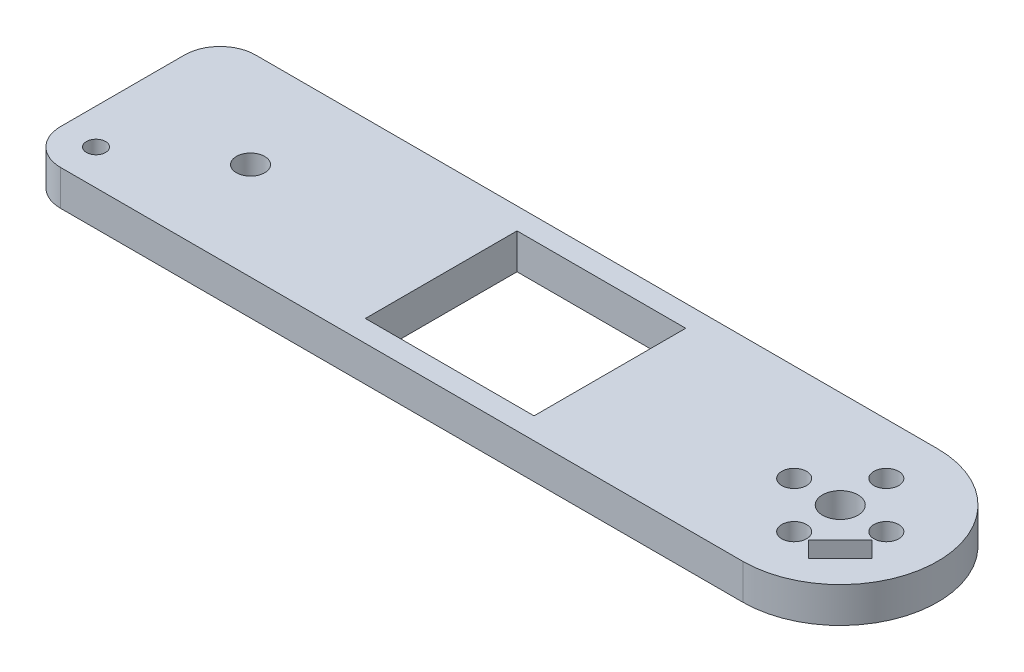
ISO-10303-21;
HEADER;
FILE_DESCRIPTION(('STEP AP214'),'2;1');
FILE_NAME('part.step','',(''),(''),'','','');
FILE_SCHEMA(('AUTOMOTIVE_DESIGN { 1 0 10303 214 1 1 1 1 }'));
ENDSEC;
DATA;
#1=APPLICATION_CONTEXT('core data for automotive mechanical design processes');
#2=APPLICATION_PROTOCOL_DEFINITION('international standard','automotive_design',2000,#1);
#3=PRODUCT_CONTEXT('',#1,'mechanical');
#4=PRODUCT('Part','Part','',(#3));
#5=PRODUCT_RELATED_PRODUCT_CATEGORY('part','',(#4));
#6=PRODUCT_DEFINITION_FORMATION('','',#4);
#7=PRODUCT_DEFINITION_CONTEXT('part definition',#1,'design');
#8=PRODUCT_DEFINITION('design','',#6,#7);
#9=PRODUCT_DEFINITION_SHAPE('','',#8);
#10=(LENGTH_UNIT() NAMED_UNIT(*) SI_UNIT(.MILLI.,.METRE.));
#11=(NAMED_UNIT(*) PLANE_ANGLE_UNIT() SI_UNIT($,.RADIAN.));
#12=(NAMED_UNIT(*) SI_UNIT($,.STERADIAN.) SOLID_ANGLE_UNIT());
#13=UNCERTAINTY_MEASURE_WITH_UNIT(LENGTH_MEASURE(1.E-05),#10,'distance_accuracy_value','');
#14=(GEOMETRIC_REPRESENTATION_CONTEXT(3) GLOBAL_UNCERTAINTY_ASSIGNED_CONTEXT((#13)) GLOBAL_UNIT_ASSIGNED_CONTEXT((#10,
#11,#12)) REPRESENTATION_CONTEXT('',''));
#15=CARTESIAN_POINT('',(0.,0.,0.));
#16=DIRECTION('',(0.,0.,1.));
#17=DIRECTION('',(1.,0.,0.));
#18=AXIS2_PLACEMENT_3D('',#15,#16,#17);
#19=CARTESIAN_POINT('',(0.,10.,0.));
#20=DIRECTION('',(0.,1.,0.));
#21=DIRECTION('',(0.,0.,1.));
#22=AXIS2_PLACEMENT_3D('',#19,#20,#21);
#23=PLANE('',#22);
#24=CARTESIAN_POINT('',(-105.,10.,17.5));
#25=DIRECTION('',(0.,-1.,0.));
#26=DIRECTION('',(0.,0.,-1.));
#27=AXIS2_PLACEMENT_3D('',#24,#25,#26);
#28=CIRCLE('',#27,2.7);
#29=CARTESIAN_POINT('',(-105.,10.,14.8));
#30=VERTEX_POINT('',#29);
#31=EDGE_CURVE('E561',#30,#30,#28,.T.);
#32=ORIENTED_EDGE('',*,*,#31,.T.);
#33=EDGE_LOOP('',(#32));
#34=FACE_BOUND('',#33,.T.);
#35=DIRECTION('',(0.707106781186546,0.,0.707106781186549));
#36=VECTOR('',#35,1.);
#37=CARTESIAN_POINT('',(39.2598719394656,10.,-39.2598719394654));
#38=LINE('',#37,#36);
#39=CARTESIAN_POINT('',(91.5411152544811,10.,13.0213713755503));
#40=VERTEX_POINT('',#39);
#41=CARTESIAN_POINT('',(96.0312433150156,10.,17.5114994360849));
#42=VERTEX_POINT('',#41);
#43=EDGE_CURVE('E166',#40,#42,#38,.T.);
#44=ORIENTED_EDGE('',*,*,#43,.F.);
#45=DIRECTION('',(-0.70710678118655,0.,0.707106781186545));
#46=VECTOR('',#45,1.);
#47=CARTESIAN_POINT('',(52.2812433150154,10.,52.2812433150157));
#48=LINE('',#47,#46);
#49=CARTESIAN_POINT('',(100.52137137555,10.,4.04111525448118));
#50=VERTEX_POINT('',#49);
#51=EDGE_CURVE('E159',#50,#40,#48,.T.);
#52=ORIENTED_EDGE('',*,*,#51,.F.);
#53=DIRECTION('',(-0.707106781186546,0.,-0.707106781186549));
#54=VECTOR('',#53,1.);
#55=CARTESIAN_POINT('',(48.2401280605347,10.,-48.2401280605345));
#56=LINE('',#55,#54);
#57=CARTESIAN_POINT('',(105.011499436085,10.,8.53124331501577));
#58=VERTEX_POINT('',#57);
#59=EDGE_CURVE('E139',#58,#50,#56,.T.);
#60=ORIENTED_EDGE('',*,*,#59,.F.);
#61=DIRECTION('',(0.70710678118655,0.,-0.707106781186545));
#62=VECTOR('',#61,1.);
#63=CARTESIAN_POINT('',(56.7713713755499,10.,56.7713713755503));
#64=LINE('',#63,#62);
#65=EDGE_CURVE('E164',#42,#58,#64,.T.);
#66=ORIENTED_EDGE('',*,*,#65,.F.);
#67=EDGE_LOOP('',(#44,#52,#60,#66));
#68=FACE_BOUND('',#67,.T.);
#69=DIRECTION('',(0.,0.,-1.));
#70=VECTOR('',#69,1.);
#71=CARTESIAN_POINT('',(-115.,10.,27.5));
#72=LINE('',#71,#70);
#73=CARTESIAN_POINT('',(-115.,10.,17.5));
#74=VERTEX_POINT('',#73);
#75=CARTESIAN_POINT('',(-115.,10.,-17.5));
#76=VERTEX_POINT('',#75);
#77=EDGE_CURVE('E238',#74,#76,#72,.T.);
#78=ORIENTED_EDGE('',*,*,#77,.F.);
#79=CARTESIAN_POINT('',(-105.,10.,17.5));
#80=DIRECTION('',(0.,1.,0.));
#81=DIRECTION('',(0.,0.,1.));
#82=AXIS2_PLACEMENT_3D('',#79,#80,#81);
#83=CIRCLE('',#82,10.);
#84=CARTESIAN_POINT('',(-105.,10.,27.5));
#85=VERTEX_POINT('',#84);
#86=EDGE_CURVE('E41',#74,#85,#83,.T.);
#87=ORIENTED_EDGE('',*,*,#86,.T.);
#88=DIRECTION('',(1.,0.,0.));
#89=VECTOR('',#88,1.);
#90=CARTESIAN_POINT('',(87.5,10.,27.5));
#91=LINE('',#90,#89);
#92=CARTESIAN_POINT('',(87.5,10.,27.5));
#93=VERTEX_POINT('',#92);
#94=EDGE_CURVE('E248',#85,#93,#91,.T.);
#95=ORIENTED_EDGE('',*,*,#94,.T.);
#96=CARTESIAN_POINT('',(87.5,10.,0.));
#97=DIRECTION('',(0.,1.,0.));
#98=DIRECTION('',(0.,0.,1.));
#99=AXIS2_PLACEMENT_3D('',#96,#97,#98);
#100=CIRCLE('',#99,27.5);
#101=CARTESIAN_POINT('',(87.5,10.,-27.5));
#102=VERTEX_POINT('',#101);
#103=EDGE_CURVE('E244',#102,#93,#100,.F.);
#104=ORIENTED_EDGE('',*,*,#103,.F.);
#105=DIRECTION('',(-1.,0.,0.));
#106=VECTOR('',#105,1.);
#107=CARTESIAN_POINT('',(87.5,10.,-27.5));
#108=LINE('',#107,#106);
#109=CARTESIAN_POINT('',(-105.,10.,-27.5));
#110=VERTEX_POINT('',#109);
#111=EDGE_CURVE('E250',#102,#110,#108,.T.);
#112=ORIENTED_EDGE('',*,*,#111,.T.);
#113=CARTESIAN_POINT('',(-105.,10.,-17.5));
#114=DIRECTION('',(0.,1.,0.));
#115=DIRECTION('',(0.,0.,1.));
#116=AXIS2_PLACEMENT_3D('',#113,#114,#115);
#117=CIRCLE('',#116,10.);
#118=EDGE_CURVE('E275',#110,#76,#117,.T.);
#119=ORIENTED_EDGE('',*,*,#118,.T.);
#120=EDGE_LOOP('',(#78,#87,#95,#104,#112,#119));
#121=FACE_BOUND('',#120,.T.);
#122=CARTESIAN_POINT('',(87.5,10.,0.));
#123=DIRECTION('',(0.,-1.,0.));
#124=DIRECTION('',(0.,0.,-1.));
#125=AXIS2_PLACEMENT_3D('',#122,#123,#124);
#126=CIRCLE('',#125,5.);
#127=CARTESIAN_POINT('',(87.5,10.,-5.));
#128=VERTEX_POINT('',#127);
#129=EDGE_CURVE('E232',#128,#128,#126,.T.);
#130=ORIENTED_EDGE('',*,*,#129,.T.);
#131=EDGE_LOOP('',(#130));
#132=FACE_BOUND('',#131,.T.);
#133=CARTESIAN_POINT('',(87.5,10.,13.));
#134=DIRECTION('',(0.,1.,0.));
#135=DIRECTION('',(0.,0.,1.));
#136=AXIS2_PLACEMENT_3D('',#133,#134,#135);
#137=CIRCLE('',#136,3.5);
#138=CARTESIAN_POINT('',(87.5,10.,16.5));
#139=VERTEX_POINT('',#138);
#140=EDGE_CURVE('E223',#139,#139,#137,.T.);
#141=ORIENTED_EDGE('',*,*,#140,.F.);
#142=EDGE_LOOP('',(#141));
#143=FACE_BOUND('',#142,.T.);
#144=CARTESIAN_POINT('',(100.5,10.,0.));
#145=DIRECTION('',(0.,1.,0.));
#146=DIRECTION('',(0.,0.,1.));
#147=AXIS2_PLACEMENT_3D('',#144,#145,#146);
#148=CIRCLE('',#147,3.5);
#149=CARTESIAN_POINT('',(100.5,10.,3.5));
#150=VERTEX_POINT('',#149);
#151=EDGE_CURVE('E217',#150,#150,#148,.T.);
#152=ORIENTED_EDGE('',*,*,#151,.F.);
#153=EDGE_LOOP('',(#152));
#154=FACE_BOUND('',#153,.T.);
#155=CARTESIAN_POINT('',(74.5,10.,0.));
#156=DIRECTION('',(0.,1.,0.));
#157=DIRECTION('',(0.,0.,1.));
#158=AXIS2_PLACEMENT_3D('',#155,#156,#157);
#159=CIRCLE('',#158,3.5);
#160=CARTESIAN_POINT('',(74.5,10.,3.5));
#161=VERTEX_POINT('',#160);
#162=EDGE_CURVE('E211',#161,#161,#159,.T.);
#163=ORIENTED_EDGE('',*,*,#162,.F.);
#164=EDGE_LOOP('',(#163));
#165=FACE_BOUND('',#164,.T.);
#166=CARTESIAN_POINT('',(87.5,10.,-13.));
#167=DIRECTION('',(0.,1.,0.));
#168=DIRECTION('',(0.,0.,1.));
#169=AXIS2_PLACEMENT_3D('',#166,#167,#168);
#170=CIRCLE('',#169,3.5);
#171=CARTESIAN_POINT('',(87.5,10.,-9.5));
#172=VERTEX_POINT('',#171);
#173=EDGE_CURVE('E203',#172,#172,#170,.T.);
#174=ORIENTED_EDGE('',*,*,#173,.F.);
#175=EDGE_LOOP('',(#174));
#176=FACE_BOUND('',#175,.T.);
#177=CARTESIAN_POINT('',(-78.9,10.,0.));
#178=DIRECTION('',(0.,-1.,0.));
#179=DIRECTION('',(0.,0.,-1.));
#180=AXIS2_PLACEMENT_3D('',#177,#178,#179);
#181=CIRCLE('',#180,4.00000000000001);
#182=CARTESIAN_POINT('',(-78.9,10.,-4.00000000000001));
#183=VERTEX_POINT('',#182);
#184=EDGE_CURVE('E200',#183,#183,#181,.T.);
#185=ORIENTED_EDGE('',*,*,#184,.T.);
#186=EDGE_LOOP('',(#185));
#187=FACE_BOUND('',#186,.T.);
#188=DIRECTION('',(-1.,0.,0.));
#189=VECTOR('',#188,1.);
#190=CARTESIAN_POINT('',(0.,10.,21.4));
#191=LINE('',#190,#189);
#192=CARTESIAN_POINT('',(22.4999999999998,10.,21.4));
#193=VERTEX_POINT('',#192);
#194=CARTESIAN_POINT('',(-25.1,10.,21.4));
#195=VERTEX_POINT('',#194);
#196=EDGE_CURVE('E177',#193,#195,#191,.T.);
#197=ORIENTED_EDGE('',*,*,#196,.T.);
#198=DIRECTION('',(0.,0.,1.));
#199=VECTOR('',#198,1.);
#200=CARTESIAN_POINT('',(-25.1,10.,0.));
#201=LINE('',#200,#199);
#202=CARTESIAN_POINT('',(-25.1,10.,-21.4));
#203=VERTEX_POINT('',#202);
#204=EDGE_CURVE('E169',#203,#195,#201,.T.);
#205=ORIENTED_EDGE('',*,*,#204,.F.);
#206=DIRECTION('',(-1.,0.,0.));
#207=VECTOR('',#206,1.);
#208=CARTESIAN_POINT('',(0.,10.,-21.4));
#209=LINE('',#208,#207);
#210=CARTESIAN_POINT('',(22.5,10.,-21.4));
#211=VERTEX_POINT('',#210);
#212=EDGE_CURVE('E171',#211,#203,#209,.T.);
#213=ORIENTED_EDGE('',*,*,#212,.F.);
#214=DIRECTION('',(0.,0.,1.));
#215=VECTOR('',#214,1.);
#216=CARTESIAN_POINT('',(22.4999999999998,10.,0.));
#217=LINE('',#216,#215);
#218=EDGE_CURVE('E174',#211,#193,#217,.T.);
#219=ORIENTED_EDGE('',*,*,#218,.T.);
#220=EDGE_LOOP('',(#197,#205,#213,#219));
#221=FACE_BOUND('',#220,.T.);
#222=ADVANCED_FACE('F33',(#34,#68,#121,#132,#143,#154,#165,#176,#187,#221),#23,.T.);
#223=CARTESIAN_POINT('',(0.,0.,0.));
#224=DIRECTION('',(0.,1.,0.));
#225=DIRECTION('',(0.,0.,1.));
#226=AXIS2_PLACEMENT_3D('',#223,#224,#225);
#227=PLANE('',#226);
#228=CARTESIAN_POINT('',(-105.,0.,17.5));
#229=DIRECTION('',(0.,-1.,0.));
#230=DIRECTION('',(0.,0.,-1.));
#231=AXIS2_PLACEMENT_3D('',#228,#229,#230);
#232=CIRCLE('',#231,2.7);
#233=CARTESIAN_POINT('',(-105.,0.,14.8));
#234=VERTEX_POINT('',#233);
#235=EDGE_CURVE('E564',#234,#234,#232,.T.);
#236=ORIENTED_EDGE('',*,*,#235,.F.);
#237=EDGE_LOOP('',(#236));
#238=FACE_BOUND('',#237,.T.);
#239=DIRECTION('',(0.70710678118655,0.,-0.707106781186545));
#240=VECTOR('',#239,1.);
#241=CARTESIAN_POINT('',(91.5411152544811,0.,13.0213713755503));
#242=LINE('',#241,#240);
#243=CARTESIAN_POINT('',(91.5411152544811,0.,13.0213713755503));
#244=VERTEX_POINT('',#243);
#245=CARTESIAN_POINT('',(100.52137137555,0.,4.04111525448119));
#246=VERTEX_POINT('',#245);
#247=EDGE_CURVE('E145',#244,#246,#242,.T.);
#248=ORIENTED_EDGE('',*,*,#247,.F.);
#249=DIRECTION('',(-0.707106781186546,0.,-0.707106781186549));
#250=VECTOR('',#249,1.);
#251=CARTESIAN_POINT('',(91.5411152544811,0.,13.0213713755503));
#252=LINE('',#251,#250);
#253=CARTESIAN_POINT('',(96.0312433150156,0.,17.5114994360849));
#254=VERTEX_POINT('',#253);
#255=EDGE_CURVE('E56',#254,#244,#252,.T.);
#256=ORIENTED_EDGE('',*,*,#255,.F.);
#257=DIRECTION('',(-0.70710678118655,0.,0.707106781186545));
#258=VECTOR('',#257,1.);
#259=CARTESIAN_POINT('',(96.0312433150156,0.,17.5114994360849));
#260=LINE('',#259,#258);
#261=CARTESIAN_POINT('',(105.011499436085,0.,8.53124331501577));
#262=VERTEX_POINT('',#261);
#263=EDGE_CURVE('E152',#262,#254,#260,.T.);
#264=ORIENTED_EDGE('',*,*,#263,.F.);
#265=DIRECTION('',(0.707106781186546,0.,0.707106781186549));
#266=VECTOR('',#265,1.);
#267=CARTESIAN_POINT('',(100.52137137555,0.,4.04111525448119));
#268=LINE('',#267,#266);
#269=EDGE_CURVE('E136',#246,#262,#268,.T.);
#270=ORIENTED_EDGE('',*,*,#269,.F.);
#271=EDGE_LOOP('',(#248,#256,#264,#270));
#272=FACE_BOUND('',#271,.T.);
#273=DIRECTION('',(1.,0.,0.));
#274=VECTOR('',#273,1.);
#275=CARTESIAN_POINT('',(87.5,0.,27.5));
#276=LINE('',#275,#274);
#277=CARTESIAN_POINT('',(-105.,0.,27.5));
#278=VERTEX_POINT('',#277);
#279=CARTESIAN_POINT('',(87.5,0.,27.5));
#280=VERTEX_POINT('',#279);
#281=EDGE_CURVE('E247',#278,#280,#276,.T.);
#282=ORIENTED_EDGE('',*,*,#281,.F.);
#283=CARTESIAN_POINT('',(-105.,0.,17.5));
#284=DIRECTION('',(0.,1.,0.));
#285=DIRECTION('',(0.,0.,1.));
#286=AXIS2_PLACEMENT_3D('',#283,#284,#285);
#287=CIRCLE('',#286,10.);
#288=CARTESIAN_POINT('',(-115.,0.,17.5));
#289=VERTEX_POINT('',#288);
#290=EDGE_CURVE('E268',#278,#289,#287,.F.);
#291=ORIENTED_EDGE('',*,*,#290,.T.);
#292=DIRECTION('',(0.,0.,-1.));
#293=VECTOR('',#292,1.);
#294=CARTESIAN_POINT('',(-115.,0.,27.5));
#295=LINE('',#294,#293);
#296=CARTESIAN_POINT('',(-115.,0.,-17.5));
#297=VERTEX_POINT('',#296);
#298=EDGE_CURVE('E235',#289,#297,#295,.T.);
#299=ORIENTED_EDGE('',*,*,#298,.T.);
#300=CARTESIAN_POINT('',(-105.,0.,-17.5));
#301=DIRECTION('',(0.,1.,0.));
#302=DIRECTION('',(0.,0.,1.));
#303=AXIS2_PLACEMENT_3D('',#300,#301,#302);
#304=CIRCLE('',#303,10.);
#305=CARTESIAN_POINT('',(-105.,0.,-27.5));
#306=VERTEX_POINT('',#305);
#307=EDGE_CURVE('E266',#297,#306,#304,.F.);
#308=ORIENTED_EDGE('',*,*,#307,.T.);
#309=DIRECTION('',(-1.,0.,0.));
#310=VECTOR('',#309,1.);
#311=CARTESIAN_POINT('',(87.5,0.,-27.5));
#312=LINE('',#311,#310);
#313=CARTESIAN_POINT('',(87.5,0.,-27.5));
#314=VERTEX_POINT('',#313);
#315=EDGE_CURVE('E251',#314,#306,#312,.T.);
#316=ORIENTED_EDGE('',*,*,#315,.F.);
#317=CARTESIAN_POINT('',(87.5,0.,0.));
#318=DIRECTION('',(0.,-1.,0.));
#319=DIRECTION('',(0.,0.,-1.));
#320=AXIS2_PLACEMENT_3D('',#317,#318,#319);
#321=CIRCLE('',#320,27.5);
#322=EDGE_CURVE('E241',#314,#280,#321,.T.);
#323=ORIENTED_EDGE('',*,*,#322,.T.);
#324=EDGE_LOOP('',(#282,#291,#299,#308,#316,#323));
#325=FACE_BOUND('',#324,.T.);
#326=CARTESIAN_POINT('',(87.5,0.,0.));
#327=DIRECTION('',(0.,-1.,0.));
#328=DIRECTION('',(0.,0.,-1.));
#329=AXIS2_PLACEMENT_3D('',#326,#327,#328);
#330=CIRCLE('',#329,5.);
#331=CARTESIAN_POINT('',(87.5,0.,-5.));
#332=VERTEX_POINT('',#331);
#333=EDGE_CURVE('E229',#332,#332,#330,.T.);
#334=ORIENTED_EDGE('',*,*,#333,.F.);
#335=EDGE_LOOP('',(#334));
#336=FACE_BOUND('',#335,.T.);
#337=CARTESIAN_POINT('',(87.5,0.,13.));
#338=DIRECTION('',(0.,1.,0.));
#339=DIRECTION('',(0.,0.,1.));
#340=AXIS2_PLACEMENT_3D('',#337,#338,#339);
#341=CIRCLE('',#340,3.5);
#342=CARTESIAN_POINT('',(87.5,0.,16.5));
#343=VERTEX_POINT('',#342);
#344=EDGE_CURVE('E226',#343,#343,#341,.T.);
#345=ORIENTED_EDGE('',*,*,#344,.T.);
#346=EDGE_LOOP('',(#345));
#347=FACE_BOUND('',#346,.T.);
#348=CARTESIAN_POINT('',(100.5,0.,0.));
#349=DIRECTION('',(0.,1.,0.));
#350=DIRECTION('',(0.,0.,1.));
#351=AXIS2_PLACEMENT_3D('',#348,#349,#350);
#352=CIRCLE('',#351,3.5);
#353=CARTESIAN_POINT('',(100.5,0.,3.5));
#354=VERTEX_POINT('',#353);
#355=EDGE_CURVE('E220',#354,#354,#352,.T.);
#356=ORIENTED_EDGE('',*,*,#355,.T.);
#357=EDGE_LOOP('',(#356));
#358=FACE_BOUND('',#357,.T.);
#359=CARTESIAN_POINT('',(74.5,0.,0.));
#360=DIRECTION('',(0.,1.,0.));
#361=DIRECTION('',(0.,0.,1.));
#362=AXIS2_PLACEMENT_3D('',#359,#360,#361);
#363=CIRCLE('',#362,3.5);
#364=CARTESIAN_POINT('',(74.5,0.,3.5));
#365=VERTEX_POINT('',#364);
#366=EDGE_CURVE('E214',#365,#365,#363,.T.);
#367=ORIENTED_EDGE('',*,*,#366,.T.);
#368=EDGE_LOOP('',(#367));
#369=FACE_BOUND('',#368,.T.);
#370=CARTESIAN_POINT('',(87.5,0.,-13.));
#371=DIRECTION('',(0.,1.,0.));
#372=DIRECTION('',(0.,0.,1.));
#373=AXIS2_PLACEMENT_3D('',#370,#371,#372);
#374=CIRCLE('',#373,3.5);
#375=CARTESIAN_POINT('',(87.5,0.,-9.5));
#376=VERTEX_POINT('',#375);
#377=EDGE_CURVE('E208',#376,#376,#374,.T.);
#378=ORIENTED_EDGE('',*,*,#377,.T.);
#379=EDGE_LOOP('',(#378));
#380=FACE_BOUND('',#379,.T.);
#381=CARTESIAN_POINT('',(-78.9,0.,0.));
#382=DIRECTION('',(0.,-1.,0.));
#383=DIRECTION('',(0.,0.,-1.));
#384=AXIS2_PLACEMENT_3D('',#381,#382,#383);
#385=CIRCLE('',#384,4.00000000000001);
#386=CARTESIAN_POINT('',(-78.9,0.,-4.00000000000001));
#387=VERTEX_POINT('',#386);
#388=EDGE_CURVE('E193',#387,#387,#385,.T.);
#389=ORIENTED_EDGE('',*,*,#388,.F.);
#390=EDGE_LOOP('',(#389));
#391=FACE_BOUND('',#390,.T.);
#392=DIRECTION('',(0.,0.,1.));
#393=VECTOR('',#392,1.);
#394=CARTESIAN_POINT('',(-25.1,0.,0.));
#395=LINE('',#394,#393);
#396=CARTESIAN_POINT('',(-25.1,0.,-21.4));
#397=VERTEX_POINT('',#396);
#398=CARTESIAN_POINT('',(-25.1,0.,21.4));
#399=VERTEX_POINT('',#398);
#400=EDGE_CURVE('E168',#397,#399,#395,.T.);
#401=ORIENTED_EDGE('',*,*,#400,.T.);
#402=DIRECTION('',(-1.,0.,0.));
#403=VECTOR('',#402,1.);
#404=CARTESIAN_POINT('',(0.,0.,21.4));
#405=LINE('',#404,#403);
#406=CARTESIAN_POINT('',(22.4999999999998,0.,21.4));
#407=VERTEX_POINT('',#406);
#408=EDGE_CURVE('E172',#407,#399,#405,.T.);
#409=ORIENTED_EDGE('',*,*,#408,.F.);
#410=DIRECTION('',(0.,0.,1.));
#411=VECTOR('',#410,1.);
#412=CARTESIAN_POINT('',(22.4999999999998,0.,0.));
#413=LINE('',#412,#411);
#414=CARTESIAN_POINT('',(22.5,0.,-21.4));
#415=VERTEX_POINT('',#414);
#416=EDGE_CURVE('E186',#415,#407,#413,.T.);
#417=ORIENTED_EDGE('',*,*,#416,.F.);
#418=DIRECTION('',(-1.,0.,0.));
#419=VECTOR('',#418,1.);
#420=CARTESIAN_POINT('',(0.,0.,-21.4));
#421=LINE('',#420,#419);
#422=EDGE_CURVE('E183',#415,#397,#421,.T.);
#423=ORIENTED_EDGE('',*,*,#422,.T.);
#424=EDGE_LOOP('',(#401,#409,#417,#423));
#425=FACE_BOUND('',#424,.T.);
#426=ADVANCED_FACE('F149',(#238,#272,#325,#336,#347,#358,#369,#380,#391,#425),#227,.F.);
#427=CARTESIAN_POINT('',(87.5,10.,27.5));
#428=DIRECTION('',(0.,0.,-1.));
#429=DIRECTION('',(-1.,0.,0.));
#430=AXIS2_PLACEMENT_3D('',#427,#428,#429);
#431=PLANE('',#430);
#432=ORIENTED_EDGE('',*,*,#94,.F.);
#433=DIRECTION('',(0.,-1.,0.));
#434=VECTOR('',#433,1.);
#435=CARTESIAN_POINT('',(-105.,0.,27.5));
#436=LINE('',#435,#434);
#437=EDGE_CURVE('E263',#85,#278,#436,.T.);
#438=ORIENTED_EDGE('',*,*,#437,.T.);
#439=ORIENTED_EDGE('',*,*,#281,.T.);
#440=DIRECTION('',(0.,-1.,0.));
#441=VECTOR('',#440,1.);
#442=CARTESIAN_POINT('',(87.5,10.,27.5));
#443=LINE('',#442,#441);
#444=EDGE_CURVE('E260',#93,#280,#443,.T.);
#445=ORIENTED_EDGE('',*,*,#444,.F.);
#446=EDGE_LOOP('',(#432,#438,#439,#445));
#447=FACE_BOUND('',#446,.T.);
#448=ADVANCED_FACE('F287',(#447),#431,.F.);
#449=CARTESIAN_POINT('',(87.5,10.,-27.5));
#450=DIRECTION('',(0.,0.,1.));
#451=DIRECTION('',(1.,0.,0.));
#452=AXIS2_PLACEMENT_3D('',#449,#450,#451);
#453=PLANE('',#452);
#454=ORIENTED_EDGE('',*,*,#315,.T.);
#455=DIRECTION('',(0.,-1.,0.));
#456=VECTOR('',#455,1.);
#457=CARTESIAN_POINT('',(-105.,10.,-27.5));
#458=LINE('',#457,#456);
#459=EDGE_CURVE('E11',#306,#110,#458,.F.);
#460=ORIENTED_EDGE('',*,*,#459,.T.);
#461=ORIENTED_EDGE('',*,*,#111,.F.);
#462=DIRECTION('',(0.,-1.,0.));
#463=VECTOR('',#462,1.);
#464=CARTESIAN_POINT('',(87.5,10.,-27.5));
#465=LINE('',#464,#463);
#466=EDGE_CURVE('E254',#102,#314,#465,.T.);
#467=ORIENTED_EDGE('',*,*,#466,.T.);
#468=EDGE_LOOP('',(#454,#460,#461,#467));
#469=FACE_BOUND('',#468,.T.);
#470=ADVANCED_FACE('F299',(#469),#453,.F.);
#471=CARTESIAN_POINT('',(87.5,71.4918693812443,0.));
#472=DIRECTION('',(0.,-1.,0.));
#473=DIRECTION('',(0.,0.,-1.));
#474=AXIS2_PLACEMENT_3D('',#471,#472,#473);
#475=CYLINDRICAL_SURFACE('',#474,27.5);
#476=ORIENTED_EDGE('',*,*,#466,.F.);
#477=ORIENTED_EDGE('',*,*,#103,.T.);
#478=ORIENTED_EDGE('',*,*,#444,.T.);
#479=ORIENTED_EDGE('',*,*,#322,.F.);
#480=EDGE_LOOP('',(#476,#477,#478,#479));
#481=FACE_BOUND('',#480,.T.);
#482=ADVANCED_FACE('F303',(#481),#475,.T.);
#483=CARTESIAN_POINT('',(-115.,71.4918693812443,27.5));
#484=DIRECTION('',(-1.,0.,0.));
#485=DIRECTION('',(0.,0.,1.));
#486=AXIS2_PLACEMENT_3D('',#483,#484,#485);
#487=PLANE('',#486);
#488=ORIENTED_EDGE('',*,*,#298,.F.);
#489=DIRECTION('',(0.,-1.,0.));
#490=VECTOR('',#489,1.);
#491=CARTESIAN_POINT('',(-115.,10.,17.5));
#492=LINE('',#491,#490);
#493=EDGE_CURVE('E273',#289,#74,#492,.F.);
#494=ORIENTED_EDGE('',*,*,#493,.T.);
#495=ORIENTED_EDGE('',*,*,#77,.T.);
#496=DIRECTION('',(0.,-1.,0.));
#497=VECTOR('',#496,1.);
#498=CARTESIAN_POINT('',(-115.,0.,-17.5));
#499=LINE('',#498,#497);
#500=EDGE_CURVE('E270',#76,#297,#499,.T.);
#501=ORIENTED_EDGE('',*,*,#500,.T.);
#502=EDGE_LOOP('',(#488,#494,#495,#501));
#503=FACE_BOUND('',#502,.T.);
#504=ADVANCED_FACE('F293',(#503),#487,.T.);
#505=CARTESIAN_POINT('',(87.5,0.,0.));
#506=DIRECTION('',(0.,-1.,0.));
#507=DIRECTION('',(0.,0.,-1.));
#508=AXIS2_PLACEMENT_3D('',#505,#506,#507);
#509=CYLINDRICAL_SURFACE('',#508,5.);
#510=ORIENTED_EDGE('',*,*,#129,.F.);
#511=EDGE_LOOP('',(#510));
#512=FACE_BOUND('',#511,.T.);
#513=ORIENTED_EDGE('',*,*,#333,.T.);
#514=EDGE_LOOP('',(#513));
#515=FACE_BOUND('',#514,.T.);
#516=ADVANCED_FACE('F310',(#512,#515),#509,.F.);
#517=CARTESIAN_POINT('',(87.5,10.,13.));
#518=DIRECTION('',(0.,1.,0.));
#519=DIRECTION('',(0.,0.,1.));
#520=AXIS2_PLACEMENT_3D('',#517,#518,#519);
#521=CYLINDRICAL_SURFACE('',#520,3.5);
#522=ORIENTED_EDGE('',*,*,#344,.F.);
#523=EDGE_LOOP('',(#522));
#524=FACE_BOUND('',#523,.T.);
#525=ORIENTED_EDGE('',*,*,#140,.T.);
#526=EDGE_LOOP('',(#525));
#527=FACE_BOUND('',#526,.T.);
#528=ADVANCED_FACE('F349',(#524,#527),#521,.F.);
#529=CARTESIAN_POINT('',(100.5,10.,0.));
#530=DIRECTION('',(0.,1.,0.));
#531=DIRECTION('',(0.,0.,1.));
#532=AXIS2_PLACEMENT_3D('',#529,#530,#531);
#533=CYLINDRICAL_SURFACE('',#532,3.5);
#534=ORIENTED_EDGE('',*,*,#355,.F.);
#535=EDGE_LOOP('',(#534));
#536=FACE_BOUND('',#535,.T.);
#537=ORIENTED_EDGE('',*,*,#151,.T.);
#538=EDGE_LOOP('',(#537));
#539=FACE_BOUND('',#538,.T.);
#540=ADVANCED_FACE('F339',(#536,#539),#533,.F.);
#541=CARTESIAN_POINT('',(74.5,10.,0.));
#542=DIRECTION('',(0.,1.,0.));
#543=DIRECTION('',(0.,0.,1.));
#544=AXIS2_PLACEMENT_3D('',#541,#542,#543);
#545=CYLINDRICAL_SURFACE('',#544,3.5);
#546=ORIENTED_EDGE('',*,*,#366,.F.);
#547=EDGE_LOOP('',(#546));
#548=FACE_BOUND('',#547,.T.);
#549=ORIENTED_EDGE('',*,*,#162,.T.);
#550=EDGE_LOOP('',(#549));
#551=FACE_BOUND('',#550,.T.);
#552=ADVANCED_FACE('F333',(#548,#551),#545,.F.);
#553=CARTESIAN_POINT('',(87.5,10.,-13.));
#554=DIRECTION('',(0.,1.,0.));
#555=DIRECTION('',(0.,0.,1.));
#556=AXIS2_PLACEMENT_3D('',#553,#554,#555);
#557=CYLINDRICAL_SURFACE('',#556,3.5);
#558=ORIENTED_EDGE('',*,*,#377,.F.);
#559=EDGE_LOOP('',(#558));
#560=FACE_BOUND('',#559,.T.);
#561=ORIENTED_EDGE('',*,*,#173,.T.);
#562=EDGE_LOOP('',(#561));
#563=FACE_BOUND('',#562,.T.);
#564=ADVANCED_FACE('F327',(#560,#563),#557,.F.);
#565=CARTESIAN_POINT('',(-105.,10.,17.5));
#566=DIRECTION('',(0.,1.,0.));
#567=DIRECTION('',(0.,0.,1.));
#568=AXIS2_PLACEMENT_3D('',#565,#566,#567);
#569=CYLINDRICAL_SURFACE('',#568,10.);
#570=ORIENTED_EDGE('',*,*,#86,.F.);
#571=ORIENTED_EDGE('',*,*,#493,.F.);
#572=ORIENTED_EDGE('',*,*,#290,.F.);
#573=ORIENTED_EDGE('',*,*,#437,.F.);
#574=EDGE_LOOP('',(#570,#571,#572,#573));
#575=FACE_BOUND('',#574,.T.);
#576=ADVANCED_FACE('F289',(#575),#569,.T.);
#577=CARTESIAN_POINT('',(-105.,71.4918693812443,-17.5));
#578=DIRECTION('',(0.,1.,0.));
#579=DIRECTION('',(0.,0.,1.));
#580=AXIS2_PLACEMENT_3D('',#577,#578,#579);
#581=CYLINDRICAL_SURFACE('',#580,10.);
#582=ORIENTED_EDGE('',*,*,#118,.F.);
#583=ORIENTED_EDGE('',*,*,#459,.F.);
#584=ORIENTED_EDGE('',*,*,#307,.F.);
#585=ORIENTED_EDGE('',*,*,#500,.F.);
#586=EDGE_LOOP('',(#582,#583,#584,#585));
#587=FACE_BOUND('',#586,.T.);
#588=ADVANCED_FACE('F35',(#587),#581,.T.);
#589=CARTESIAN_POINT('',(-78.9,10.,0.));
#590=DIRECTION('',(0.,-1.,0.));
#591=DIRECTION('',(0.,0.,-1.));
#592=AXIS2_PLACEMENT_3D('',#589,#590,#591);
#593=CYLINDRICAL_SURFACE('',#592,4.00000000000001);
#594=ORIENTED_EDGE('',*,*,#184,.F.);
#595=EDGE_LOOP('',(#594));
#596=FACE_BOUND('',#595,.T.);
#597=ORIENTED_EDGE('',*,*,#388,.T.);
#598=EDGE_LOOP('',(#597));
#599=FACE_BOUND('',#598,.T.);
#600=ADVANCED_FACE('F332',(#596,#599),#593,.F.);
#601=CARTESIAN_POINT('',(-25.1,10.,0.));
#602=DIRECTION('',(1.,0.,0.));
#603=DIRECTION('',(0.,0.,-1.));
#604=AXIS2_PLACEMENT_3D('',#601,#602,#603);
#605=PLANE('',#604);
#606=ORIENTED_EDGE('',*,*,#400,.F.);
#607=DIRECTION('',(0.,-1.,0.));
#608=VECTOR('',#607,1.);
#609=CARTESIAN_POINT('',(-25.1,10.,-21.4));
#610=LINE('',#609,#608);
#611=EDGE_CURVE('E180',#203,#397,#610,.T.);
#612=ORIENTED_EDGE('',*,*,#611,.F.);
#613=ORIENTED_EDGE('',*,*,#204,.T.);
#614=DIRECTION('',(0.,-1.,0.));
#615=VECTOR('',#614,1.);
#616=CARTESIAN_POINT('',(-25.1,10.,21.4));
#617=LINE('',#616,#615);
#618=EDGE_CURVE('E191',#195,#399,#617,.T.);
#619=ORIENTED_EDGE('',*,*,#618,.T.);
#620=EDGE_LOOP('',(#606,#612,#613,#619));
#621=FACE_BOUND('',#620,.T.);
#622=ADVANCED_FACE('F376',(#621),#605,.T.);
#623=CARTESIAN_POINT('',(0.,10.,21.4));
#624=DIRECTION('',(0.,0.,1.));
#625=DIRECTION('',(1.,0.,0.));
#626=AXIS2_PLACEMENT_3D('',#623,#624,#625);
#627=PLANE('',#626);
#628=ORIENTED_EDGE('',*,*,#408,.T.);
#629=ORIENTED_EDGE('',*,*,#618,.F.);
#630=ORIENTED_EDGE('',*,*,#196,.F.);
#631=DIRECTION('',(0.,-1.,0.));
#632=VECTOR('',#631,1.);
#633=CARTESIAN_POINT('',(22.4999999999998,10.,21.4));
#634=LINE('',#633,#632);
#635=EDGE_CURVE('E194',#193,#407,#634,.T.);
#636=ORIENTED_EDGE('',*,*,#635,.T.);
#637=EDGE_LOOP('',(#628,#629,#630,#636));
#638=FACE_BOUND('',#637,.T.);
#639=ADVANCED_FACE('F386',(#638),#627,.F.);
#640=CARTESIAN_POINT('',(22.4999999999998,10.,0.));
#641=DIRECTION('',(1.,0.,0.));
#642=DIRECTION('',(0.,0.,-1.));
#643=AXIS2_PLACEMENT_3D('',#640,#641,#642);
#644=PLANE('',#643);
#645=ORIENTED_EDGE('',*,*,#416,.T.);
#646=ORIENTED_EDGE('',*,*,#635,.F.);
#647=ORIENTED_EDGE('',*,*,#218,.F.);
#648=DIRECTION('',(0.,-1.,0.));
#649=VECTOR('',#648,1.);
#650=CARTESIAN_POINT('',(22.5,10.,-21.4));
#651=LINE('',#650,#649);
#652=EDGE_CURVE('E196',#211,#415,#651,.T.);
#653=ORIENTED_EDGE('',*,*,#652,.T.);
#654=EDGE_LOOP('',(#645,#646,#647,#653));
#655=FACE_BOUND('',#654,.T.);
#656=ADVANCED_FACE('F388',(#655),#644,.F.);
#657=CARTESIAN_POINT('',(0.,10.,-21.4));
#658=DIRECTION('',(0.,0.,1.));
#659=DIRECTION('',(1.,0.,0.));
#660=AXIS2_PLACEMENT_3D('',#657,#658,#659);
#661=PLANE('',#660);
#662=ORIENTED_EDGE('',*,*,#422,.F.);
#663=ORIENTED_EDGE('',*,*,#652,.F.);
#664=ORIENTED_EDGE('',*,*,#212,.T.);
#665=ORIENTED_EDGE('',*,*,#611,.T.);
#666=EDGE_LOOP('',(#662,#663,#664,#665));
#667=FACE_BOUND('',#666,.T.);
#668=ADVANCED_FACE('F380',(#667),#661,.T.);
#669=CARTESIAN_POINT('',(91.5411152544811,12.7,13.0213713755503));
#670=DIRECTION('',(-0.707106781186549,0.,0.707106781186546));
#671=DIRECTION('',(0.707106781186546,0.,0.707106781186549));
#672=AXIS2_PLACEMENT_3D('',#669,#670,#671);
#673=PLANE('',#672);
#674=ORIENTED_EDGE('',*,*,#43,.T.);
#675=DIRECTION('',(0.,-1.,0.));
#676=VECTOR('',#675,1.);
#677=CARTESIAN_POINT('',(96.0312433150156,12.7,17.5114994360849));
#678=LINE('',#677,#676);
#679=EDGE_CURVE('E157',#42,#254,#678,.T.);
#680=ORIENTED_EDGE('',*,*,#679,.T.);
#681=ORIENTED_EDGE('',*,*,#255,.T.);
#682=DIRECTION('',(0.,-1.,0.));
#683=VECTOR('',#682,1.);
#684=CARTESIAN_POINT('',(91.5411152544811,12.7,13.0213713755503));
#685=LINE('',#684,#683);
#686=EDGE_CURVE('E142',#40,#244,#685,.T.);
#687=ORIENTED_EDGE('',*,*,#686,.F.);
#688=EDGE_LOOP('',(#674,#680,#681,#687));
#689=FACE_BOUND('',#688,.T.);
#690=ADVANCED_FACE('F395',(#689),#673,.F.);
#691=CARTESIAN_POINT('',(96.0312433150156,12.7,17.5114994360849));
#692=DIRECTION('',(0.707106781186545,0.,0.70710678118655));
#693=DIRECTION('',(0.70710678118655,0.,-0.707106781186545));
#694=AXIS2_PLACEMENT_3D('',#691,#692,#693);
#695=PLANE('',#694);
#696=ORIENTED_EDGE('',*,*,#65,.T.);
#697=DIRECTION('',(0.,-1.,0.));
#698=VECTOR('',#697,1.);
#699=CARTESIAN_POINT('',(105.011499436085,12.7,8.53124331501577));
#700=LINE('',#699,#698);
#701=EDGE_CURVE('E141',#58,#262,#700,.T.);
#702=ORIENTED_EDGE('',*,*,#701,.T.);
#703=ORIENTED_EDGE('',*,*,#263,.T.);
#704=ORIENTED_EDGE('',*,*,#679,.F.);
#705=EDGE_LOOP('',(#696,#702,#703,#704));
#706=FACE_BOUND('',#705,.T.);
#707=ADVANCED_FACE('F523',(#706),#695,.F.);
#708=CARTESIAN_POINT('',(100.52137137555,12.7,4.04111525448119));
#709=DIRECTION('',(0.707106781186549,0.,-0.707106781186546));
#710=DIRECTION('',(-0.707106781186546,0.,-0.707106781186549));
#711=AXIS2_PLACEMENT_3D('',#708,#709,#710);
#712=PLANE('',#711);
#713=ORIENTED_EDGE('',*,*,#59,.T.);
#714=DIRECTION('',(0.,-1.,0.));
#715=VECTOR('',#714,1.);
#716=CARTESIAN_POINT('',(100.52137137555,12.7,4.04111525448119));
#717=LINE('',#716,#715);
#718=EDGE_CURVE('E48',#50,#246,#717,.T.);
#719=ORIENTED_EDGE('',*,*,#718,.T.);
#720=ORIENTED_EDGE('',*,*,#269,.T.);
#721=ORIENTED_EDGE('',*,*,#701,.F.);
#722=EDGE_LOOP('',(#713,#719,#720,#721));
#723=FACE_BOUND('',#722,.T.);
#724=ADVANCED_FACE('F133',(#723),#712,.F.);
#725=CARTESIAN_POINT('',(91.5411152544811,12.7,13.0213713755503));
#726=DIRECTION('',(-0.707106781186545,0.,-0.707106781186549));
#727=DIRECTION('',(-0.70710678118655,0.,0.707106781186545));
#728=AXIS2_PLACEMENT_3D('',#725,#726,#727);
#729=PLANE('',#728);
#730=ORIENTED_EDGE('',*,*,#51,.T.);
#731=ORIENTED_EDGE('',*,*,#686,.T.);
#732=ORIENTED_EDGE('',*,*,#247,.T.);
#733=ORIENTED_EDGE('',*,*,#718,.F.);
#734=EDGE_LOOP('',(#730,#731,#732,#733));
#735=FACE_BOUND('',#734,.T.);
#736=ADVANCED_FACE('F146',(#735),#729,.F.);
#737=CARTESIAN_POINT('',(-105.,10.,17.5));
#738=DIRECTION('',(0.,-1.,0.));
#739=DIRECTION('',(0.,0.,-1.));
#740=AXIS2_PLACEMENT_3D('',#737,#738,#739);
#741=CYLINDRICAL_SURFACE('',#740,2.7);
#742=ORIENTED_EDGE('',*,*,#31,.F.);
#743=EDGE_LOOP('',(#742));
#744=FACE_BOUND('',#743,.T.);
#745=ORIENTED_EDGE('',*,*,#235,.T.);
#746=EDGE_LOOP('',(#745));
#747=FACE_BOUND('',#746,.T.);
#748=ADVANCED_FACE('F544',(#744,#747),#741,.F.);
#749=CLOSED_SHELL('',(#222,#426,#448,#470,#482,#504,#516,#528,#540,#552,#564,#576,#588,#600,
#622,#639,#656,#668,#690,#707,#724,#736,#748));
#750=MANIFOLD_SOLID_BREP('B2',#749);
#751=ADVANCED_BREP_SHAPE_REPRESENTATION('',(#18,#750),#14);
#752=SHAPE_DEFINITION_REPRESENTATION(#9,#751);
ENDSEC;
END-ISO-10303-21;
